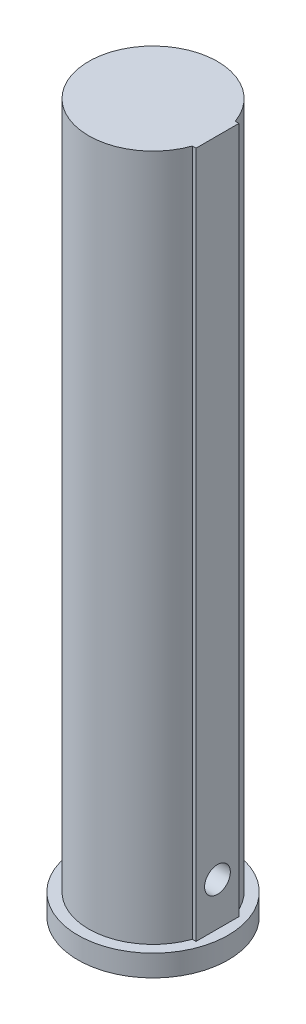
ISO-10303-21;
HEADER;
FILE_DESCRIPTION(('STEP AP214'),'2;1');
FILE_NAME('part.step','',(''),(''),'','','');
FILE_SCHEMA(('AUTOMOTIVE_DESIGN { 1 0 10303 214 1 1 1 1 }'));
ENDSEC;
DATA;
#1=APPLICATION_CONTEXT('core data for automotive mechanical design processes');
#2=APPLICATION_PROTOCOL_DEFINITION('international standard','automotive_design',2000,#1);
#3=PRODUCT_CONTEXT('',#1,'mechanical');
#4=PRODUCT('Part','Part','',(#3));
#5=PRODUCT_RELATED_PRODUCT_CATEGORY('part','',(#4));
#6=PRODUCT_DEFINITION_FORMATION('','',#4);
#7=PRODUCT_DEFINITION_CONTEXT('part definition',#1,'design');
#8=PRODUCT_DEFINITION('design','',#6,#7);
#9=PRODUCT_DEFINITION_SHAPE('','',#8);
#10=(LENGTH_UNIT() NAMED_UNIT(*) SI_UNIT(.MILLI.,.METRE.));
#11=(NAMED_UNIT(*) PLANE_ANGLE_UNIT() SI_UNIT($,.RADIAN.));
#12=(NAMED_UNIT(*) SI_UNIT($,.STERADIAN.) SOLID_ANGLE_UNIT());
#13=UNCERTAINTY_MEASURE_WITH_UNIT(LENGTH_MEASURE(1.E-05),#10,'distance_accuracy_value','');
#14=(GEOMETRIC_REPRESENTATION_CONTEXT(3) GLOBAL_UNCERTAINTY_ASSIGNED_CONTEXT((#13)) GLOBAL_UNIT_ASSIGNED_CONTEXT((#10,
#11,#12)) REPRESENTATION_CONTEXT('',''));
#15=CARTESIAN_POINT('',(0.,0.,0.));
#16=DIRECTION('',(0.,0.,1.));
#17=DIRECTION('',(1.,0.,0.));
#18=AXIS2_PLACEMENT_3D('',#15,#16,#17);
#19=CARTESIAN_POINT('',(15.,-10.0367291130165,-5.));
#20=DIRECTION('',(1.,0.,0.));
#21=DIRECTION('',(0.,0.,-1.));
#22=AXIS2_PLACEMENT_3D('',#19,#20,#21);
#23=PLANE('',#22);
#24=DIRECTION('',(0.,0.,1.));
#25=VECTOR('',#24,1.);
#26=CARTESIAN_POINT('',(15.,0.,-5.));
#27=LINE('',#26,#25);
#28=CARTESIAN_POINT('',(15.,0.,-5.));
#29=VERTEX_POINT('',#28);
#30=CARTESIAN_POINT('',(15.,0.,5.));
#31=VERTEX_POINT('',#30);
#32=EDGE_CURVE('E146',#29,#31,#27,.T.);
#33=ORIENTED_EDGE('',*,*,#32,.F.);
#34=DIRECTION('',(0.,1.,0.));
#35=VECTOR('',#34,1.);
#36=CARTESIAN_POINT('',(15.,-10.0367291130165,-5.));
#37=LINE('',#36,#35);
#38=CARTESIAN_POINT('',(15.,160.,-5.));
#39=VERTEX_POINT('',#38);
#40=EDGE_CURVE('E170',#29,#39,#37,.T.);
#41=ORIENTED_EDGE('',*,*,#40,.T.);
#42=DIRECTION('',(0.,0.,-1.));
#43=VECTOR('',#42,1.);
#44=CARTESIAN_POINT('',(15.,160.,-5.));
#45=LINE('',#44,#43);
#46=CARTESIAN_POINT('',(15.,160.,5.));
#47=VERTEX_POINT('',#46);
#48=EDGE_CURVE('E159',#47,#39,#45,.T.);
#49=ORIENTED_EDGE('',*,*,#48,.F.);
#50=DIRECTION('',(0.,1.,0.));
#51=VECTOR('',#50,1.);
#52=CARTESIAN_POINT('',(15.,-10.0367291130165,5.));
#53=LINE('',#52,#51);
#54=EDGE_CURVE('E174',#31,#47,#53,.T.);
#55=ORIENTED_EDGE('',*,*,#54,.F.);
#56=EDGE_LOOP('',(#33,#41,#49,#55));
#57=FACE_BOUND('',#56,.T.);
#58=CARTESIAN_POINT('',(15.,10.,0.));
#59=DIRECTION('',(1.,0.,0.));
#60=DIRECTION('',(0.,0.,-1.));
#61=AXIS2_PLACEMENT_3D('',#58,#59,#60);
#62=CIRCLE('',#61,3.);
#63=CARTESIAN_POINT('',(15.,10.,-3.));
#64=VERTEX_POINT('',#63);
#65=EDGE_CURVE('E121',#64,#64,#62,.T.);
#66=ORIENTED_EDGE('',*,*,#65,.F.);
#67=EDGE_LOOP('',(#66));
#68=FACE_BOUND('',#67,.T.);
#69=ADVANCED_FACE('F43',(#57,#68),#23,.T.);
#70=CARTESIAN_POINT('',(0.,10.,0.));
#71=DIRECTION('',(1.,0.,0.));
#72=DIRECTION('',(0.,0.,-1.));
#73=AXIS2_PLACEMENT_3D('',#70,#71,#72);
#74=CYLINDRICAL_SURFACE('',#73,1.5);
#75=CARTESIAN_POINT('',(1.5,9.29289321881345,-1.32287565553229));
#76=CARTESIAN_POINT('',(1.4739145337833,9.34832722563109,-1.35249536626977));
#77=CARTESIAN_POINT('',(1.44894131480395,9.40627389915971,-1.37899373581327));
#78=CARTESIAN_POINT('',(1.40359048884177,9.52745260976207,-1.42512143955085));
#79=CARTESIAN_POINT('',(1.38327621847422,9.5907431108936,-1.44465790144486));
#80=CARTESIAN_POINT('',(1.35027299373116,9.72202263899524,-1.47556624435897));
#81=CARTESIAN_POINT('',(1.33765666230707,9.79004986649171,-1.48686055778082));
#82=CARTESIAN_POINT('',(1.32310580286873,9.92771324059383,-1.49983374673648));
#83=CARTESIAN_POINT('',(1.32109194870825,9.9973335132442,-1.50158403278955));
#84=CARTESIAN_POINT('',(1.32746642679957,10.1249794958398,-1.49593899426719));
#85=CARTESIAN_POINT('',(1.33431678238416,10.1831557673976,-1.48989633105986));
#86=CARTESIAN_POINT('',(1.354748711607,10.2975451511324,-1.47134103673938));
#87=CARTESIAN_POINT('',(1.36836832201381,10.3537452260107,-1.45879182762707));
#88=CARTESIAN_POINT('',(1.40015692782228,10.4615662906112,-1.42829470664003));
#89=CARTESIAN_POINT('',(1.4182014397697,10.5132673778039,-1.4104921818831));
#90=CARTESIAN_POINT('',(1.45725096368967,10.6128886126749,-1.37011445537084));
#91=CARTESIAN_POINT('',(1.47822219020455,10.6608433308559,-1.34759242444094));
#92=CARTESIAN_POINT('',(1.5,10.7071067811865,-1.32287565553229));
#93=B_SPLINE_CURVE_WITH_KNOTS('',3,(#75,#76,#77,#78,#79,#80,#81,#82,#83,#84,#85,#86,#87,#88,#89,
#90,#91,#92),.UNSPECIFIED.,.F.,.F.,(4,2,2,2,2,2,2,2,4),(0.,0.204432365123609,0.411497905566482,
0.620487875617342,0.827911968714584,1.00373614181138,1.18055964257078,1.35288702776985,
1.52336833756426),.UNSPECIFIED.);
#94=CARTESIAN_POINT('',(1.5,9.29289321881345,-1.3228756555323));
#95=VERTEX_POINT('',#94);
#96=CARTESIAN_POINT('',(1.5,10.7071067811865,-1.32287565553229));
#97=VERTEX_POINT('',#96);
#98=EDGE_CURVE('E59',#95,#97,#93,.T.);
#99=ORIENTED_EDGE('',*,*,#98,.F.);
#100=CARTESIAN_POINT('',(1.5,10.,0.));
#101=DIRECTION('',(1.,0.,0.));
#102=DIRECTION('',(0.,0.,-1.));
#103=AXIS2_PLACEMENT_3D('',#100,#101,#102);
#104=CIRCLE('',#103,1.5);
#105=CARTESIAN_POINT('',(1.5,9.29289321881345,1.3228756555323));
#106=VERTEX_POINT('',#105);
#107=EDGE_CURVE('E47',#106,#95,#104,.T.);
#108=ORIENTED_EDGE('',*,*,#107,.F.);
#109=CARTESIAN_POINT('',(1.5,10.7071067811865,1.3228756555323));
#110=CARTESIAN_POINT('',(1.4739145337833,10.6516727743689,1.35249536626977));
#111=CARTESIAN_POINT('',(1.44894131480395,10.5937261008403,1.37899373581327));
#112=CARTESIAN_POINT('',(1.40359048884177,10.4725473902379,1.42512143955085));
#113=CARTESIAN_POINT('',(1.38327621847422,10.4092568891064,1.44465790144486));
#114=CARTESIAN_POINT('',(1.35027299373116,10.2779773610048,1.47556624435897));
#115=CARTESIAN_POINT('',(1.33765666230707,10.2099501335083,1.48686055778082));
#116=CARTESIAN_POINT('',(1.32310580286873,10.0722867594062,1.49983374673648));
#117=CARTESIAN_POINT('',(1.32109194870825,10.0026664867558,1.50158403278955));
#118=CARTESIAN_POINT('',(1.32746642679957,9.87502050416024,1.49593899426719));
#119=CARTESIAN_POINT('',(1.33431678238416,9.81684423260236,1.48989633105986));
#120=CARTESIAN_POINT('',(1.354748711607,9.70245484886757,1.47134103673938));
#121=CARTESIAN_POINT('',(1.36836832201381,9.64625477398929,1.45879182762707));
#122=CARTESIAN_POINT('',(1.40015692782228,9.53843370938881,1.42829470664004));
#123=CARTESIAN_POINT('',(1.4182014397697,9.48673262219608,1.4104921818831));
#124=CARTESIAN_POINT('',(1.45725096368967,9.38711138732506,1.37011445537084));
#125=CARTESIAN_POINT('',(1.47822219020455,9.33915666914407,1.34759242444094));
#126=CARTESIAN_POINT('',(1.5,9.29289321881345,1.32287565553229));
#127=B_SPLINE_CURVE_WITH_KNOTS('',3,(#109,#110,#111,#112,#113,#114,#115,#116,#117,#118,#119,
#120,#121,#122,#123,#124,#125,#126),.UNSPECIFIED.,.F.,.F.,(4,2,2,2,2,2,2,2,4),(0.,
0.204432365123608,0.41149790556648,0.620487875617338,0.827911968714583,1.00373614181138,
1.18055964257078,1.35288702776985,1.52336833756426),.UNSPECIFIED.);
#128=CARTESIAN_POINT('',(1.5,10.7071067811865,1.3228756555323));
#129=VERTEX_POINT('',#128);
#130=EDGE_CURVE('E110',#129,#106,#127,.T.);
#131=ORIENTED_EDGE('',*,*,#130,.F.);
#132=EDGE_CURVE('E11',#97,#129,#104,.T.);
#133=ORIENTED_EDGE('',*,*,#132,.F.);
#134=EDGE_LOOP('',(#99,#108,#131,#133));
#135=FACE_BOUND('',#134,.T.);
#136=CARTESIAN_POINT('',(8.,10.,0.));
#137=DIRECTION('',(1.,0.,0.));
#138=DIRECTION('',(0.,0.,-1.));
#139=AXIS2_PLACEMENT_3D('',#136,#137,#138);
#140=CIRCLE('',#139,1.5);
#141=CARTESIAN_POINT('',(8.,10.,-1.5));
#142=VERTEX_POINT('',#141);
#143=EDGE_CURVE('E216',#142,#142,#140,.T.);
#144=ORIENTED_EDGE('',*,*,#143,.T.);
#145=EDGE_LOOP('',(#144));
#146=FACE_BOUND('',#145,.T.);
#147=ADVANCED_FACE('F108',(#135,#146),#74,.F.);
#148=CARTESIAN_POINT('',(1.5,20.,-1.3228756555323));
#149=DIRECTION('',(1.,0.,0.));
#150=DIRECTION('',(0.,0.,-1.));
#151=AXIS2_PLACEMENT_3D('',#148,#149,#150);
#152=PLANE('',#151);
#153=DIRECTION('',(0.,-1.,0.));
#154=VECTOR('',#153,1.);
#155=CARTESIAN_POINT('',(1.5,20.,-1.3228756555323));
#156=LINE('',#155,#154);
#157=CARTESIAN_POINT('',(1.5,20.,-1.3228756555323));
#158=VERTEX_POINT('',#157);
#159=EDGE_CURVE('E128',#158,#97,#156,.T.);
#160=ORIENTED_EDGE('',*,*,#159,.T.);
#161=ORIENTED_EDGE('',*,*,#132,.T.);
#162=DIRECTION('',(0.,-1.,0.));
#163=VECTOR('',#162,1.);
#164=CARTESIAN_POINT('',(1.5,20.,1.3228756555323));
#165=LINE('',#164,#163);
#166=CARTESIAN_POINT('',(1.5,20.,1.3228756555323));
#167=VERTEX_POINT('',#166);
#168=EDGE_CURVE('E119',#167,#129,#165,.T.);
#169=ORIENTED_EDGE('',*,*,#168,.F.);
#170=DIRECTION('',(0.,0.,1.));
#171=VECTOR('',#170,1.);
#172=CARTESIAN_POINT('',(1.5,20.,-1.3228756555323));
#173=LINE('',#172,#171);
#174=EDGE_CURVE('E256',#158,#167,#173,.T.);
#175=ORIENTED_EDGE('',*,*,#174,.F.);
#176=EDGE_LOOP('',(#160,#161,#169,#175));
#177=FACE_BOUND('',#176,.T.);
#178=ADVANCED_FACE('F238',(#177),#152,.F.);
#179=CARTESIAN_POINT('',(0.,160.,0.));
#180=DIRECTION('',(0.,-1.,0.));
#181=DIRECTION('',(0.,0.,-1.));
#182=AXIS2_PLACEMENT_3D('',#179,#180,#181);
#183=CYLINDRICAL_SURFACE('',#182,15.);
#184=CARTESIAN_POINT('',(0.,160.,0.));
#185=DIRECTION('',(0.,1.,0.));
#186=DIRECTION('',(0.,0.,1.));
#187=AXIS2_PLACEMENT_3D('',#184,#185,#186);
#188=CIRCLE('',#187,15.);
#189=CARTESIAN_POINT('',(14.142135623731,160.,-5.));
#190=VERTEX_POINT('',#189);
#191=CARTESIAN_POINT('',(14.142135623731,160.,5.));
#192=VERTEX_POINT('',#191);
#193=EDGE_CURVE('E113',#190,#192,#188,.T.);
#194=ORIENTED_EDGE('',*,*,#193,.F.);
#195=DIRECTION('',(0.,1.,0.));
#196=VECTOR('',#195,1.);
#197=CARTESIAN_POINT('',(14.142135623731,-10.0367291130165,-5.));
#198=LINE('',#197,#196);
#199=CARTESIAN_POINT('',(14.142135623731,0.,-5.));
#200=VERTEX_POINT('',#199);
#201=EDGE_CURVE('E151',#200,#190,#198,.T.);
#202=ORIENTED_EDGE('',*,*,#201,.F.);
#203=CARTESIAN_POINT('',(0.,0.,0.));
#204=DIRECTION('',(0.,1.,0.));
#205=DIRECTION('',(0.,0.,1.));
#206=AXIS2_PLACEMENT_3D('',#203,#204,#205);
#207=CIRCLE('',#206,15.);
#208=CARTESIAN_POINT('',(14.142135623731,0.,5.));
#209=VERTEX_POINT('',#208);
#210=EDGE_CURVE('E182',#200,#209,#207,.T.);
#211=ORIENTED_EDGE('',*,*,#210,.T.);
#212=DIRECTION('',(0.,1.,0.));
#213=VECTOR('',#212,1.);
#214=CARTESIAN_POINT('',(14.142135623731,-10.0367291130165,5.));
#215=LINE('',#214,#213);
#216=EDGE_CURVE('E166',#209,#192,#215,.T.);
#217=ORIENTED_EDGE('',*,*,#216,.T.);
#218=EDGE_LOOP('',(#194,#202,#211,#217));
#219=FACE_BOUND('',#218,.T.);
#220=ADVANCED_FACE('F45',(#219),#183,.T.);
#221=CARTESIAN_POINT('',(0.,160.,0.));
#222=DIRECTION('',(0.,1.,0.));
#223=DIRECTION('',(0.,0.,1.));
#224=AXIS2_PLACEMENT_3D('',#221,#222,#223);
#225=PLANE('',#224);
#226=ORIENTED_EDGE('',*,*,#193,.T.);
#227=DIRECTION('',(1.,0.,0.));
#228=VECTOR('',#227,1.);
#229=CARTESIAN_POINT('',(14.142135623731,160.,5.));
#230=LINE('',#229,#228);
#231=EDGE_CURVE('E142',#192,#47,#230,.T.);
#232=ORIENTED_EDGE('',*,*,#231,.T.);
#233=ORIENTED_EDGE('',*,*,#48,.T.);
#234=DIRECTION('',(-1.,0.,0.));
#235=VECTOR('',#234,1.);
#236=CARTESIAN_POINT('',(14.142135623731,160.,-5.));
#237=LINE('',#236,#235);
#238=EDGE_CURVE('E162',#39,#190,#237,.T.);
#239=ORIENTED_EDGE('',*,*,#238,.T.);
#240=EDGE_LOOP('',(#226,#232,#233,#239));
#241=FACE_BOUND('',#240,.T.);
#242=ADVANCED_FACE('F199',(#241),#225,.T.);
#243=CARTESIAN_POINT('',(14.142135623731,-10.0367291130165,-5.));
#244=DIRECTION('',(0.,0.,-1.));
#245=DIRECTION('',(-1.,0.,0.));
#246=AXIS2_PLACEMENT_3D('',#243,#244,#245);
#247=PLANE('',#246);
#248=DIRECTION('',(1.,0.,0.));
#249=VECTOR('',#248,1.);
#250=CARTESIAN_POINT('',(14.142135623731,0.,-5.));
#251=LINE('',#250,#249);
#252=EDGE_CURVE('E150',#200,#29,#251,.T.);
#253=ORIENTED_EDGE('',*,*,#252,.F.);
#254=ORIENTED_EDGE('',*,*,#201,.T.);
#255=ORIENTED_EDGE('',*,*,#238,.F.);
#256=ORIENTED_EDGE('',*,*,#40,.F.);
#257=EDGE_LOOP('',(#253,#254,#255,#256));
#258=FACE_BOUND('',#257,.T.);
#259=ADVANCED_FACE('F202',(#258),#247,.T.);
#260=CARTESIAN_POINT('',(14.142135623731,-10.0367291130165,5.));
#261=DIRECTION('',(0.,0.,1.));
#262=DIRECTION('',(1.,0.,0.));
#263=AXIS2_PLACEMENT_3D('',#260,#261,#262);
#264=PLANE('',#263);
#265=DIRECTION('',(-1.,0.,0.));
#266=VECTOR('',#265,1.);
#267=CARTESIAN_POINT('',(14.142135623731,0.,5.));
#268=LINE('',#267,#266);
#269=EDGE_CURVE('E155',#31,#209,#268,.T.);
#270=ORIENTED_EDGE('',*,*,#269,.F.);
#271=ORIENTED_EDGE('',*,*,#54,.T.);
#272=ORIENTED_EDGE('',*,*,#231,.F.);
#273=ORIENTED_EDGE('',*,*,#216,.F.);
#274=EDGE_LOOP('',(#270,#271,#272,#273));
#275=FACE_BOUND('',#274,.T.);
#276=ADVANCED_FACE('F195',(#275),#264,.T.);
#277=CARTESIAN_POINT('',(0.,-5.,0.));
#278=DIRECTION('',(0.,1.,0.));
#279=DIRECTION('',(0.,0.,1.));
#280=AXIS2_PLACEMENT_3D('',#277,#278,#279);
#281=CYLINDRICAL_SURFACE('',#280,17.5);
#282=CARTESIAN_POINT('',(0.,-5.,0.));
#283=DIRECTION('',(0.,-1.,0.));
#284=DIRECTION('',(0.,0.,-1.));
#285=AXIS2_PLACEMENT_3D('',#282,#283,#284);
#286=CIRCLE('',#285,17.5);
#287=CARTESIAN_POINT('',(0.,-5.,-17.5));
#288=VERTEX_POINT('',#287);
#289=EDGE_CURVE('E138',#288,#288,#286,.T.);
#290=ORIENTED_EDGE('',*,*,#289,.F.);
#291=EDGE_LOOP('',(#290));
#292=FACE_BOUND('',#291,.T.);
#293=CARTESIAN_POINT('',(0.,0.,0.));
#294=DIRECTION('',(0.,-1.,0.));
#295=DIRECTION('',(0.,0.,-1.));
#296=AXIS2_PLACEMENT_3D('',#293,#294,#295);
#297=CIRCLE('',#296,17.5);
#298=CARTESIAN_POINT('',(0.,0.,-17.5));
#299=VERTEX_POINT('',#298);
#300=EDGE_CURVE('E132',#299,#299,#297,.T.);
#301=ORIENTED_EDGE('',*,*,#300,.T.);
#302=EDGE_LOOP('',(#301));
#303=FACE_BOUND('',#302,.T.);
#304=ADVANCED_FACE('F270',(#292,#303),#281,.T.);
#305=CARTESIAN_POINT('',(0.,-5.,0.));
#306=DIRECTION('',(0.,-1.,0.));
#307=DIRECTION('',(0.,0.,-1.));
#308=AXIS2_PLACEMENT_3D('',#305,#306,#307);
#309=PLANE('',#308);
#310=CARTESIAN_POINT('',(0.,-5.,0.));
#311=DIRECTION('',(0.,-1.,0.));
#312=DIRECTION('',(0.,0.,-1.));
#313=AXIS2_PLACEMENT_3D('',#310,#311,#312);
#314=CIRCLE('',#313,2.);
#315=CARTESIAN_POINT('',(1.5,-5.,1.3228756555323));
#316=VERTEX_POINT('',#315);
#317=CARTESIAN_POINT('',(1.5,-5.,-1.3228756555323));
#318=VERTEX_POINT('',#317);
#319=EDGE_CURVE('E263',#316,#318,#314,.T.);
#320=ORIENTED_EDGE('',*,*,#319,.F.);
#321=DIRECTION('',(0.,0.,1.));
#322=VECTOR('',#321,1.);
#323=CARTESIAN_POINT('',(1.5,-5.,-1.3228756555323));
#324=LINE('',#323,#322);
#325=EDGE_CURVE('E125',#318,#316,#324,.T.);
#326=ORIENTED_EDGE('',*,*,#325,.F.);
#327=EDGE_LOOP('',(#320,#326));
#328=FACE_BOUND('',#327,.T.);
#329=ORIENTED_EDGE('',*,*,#289,.T.);
#330=EDGE_LOOP('',(#329));
#331=FACE_BOUND('',#330,.T.);
#332=ADVANCED_FACE('F267',(#328,#331),#309,.T.);
#333=CARTESIAN_POINT('',(0.,0.,0.));
#334=DIRECTION('',(0.,-1.,0.));
#335=DIRECTION('',(0.,0.,-1.));
#336=AXIS2_PLACEMENT_3D('',#333,#334,#335);
#337=PLANE('',#336);
#338=ORIENTED_EDGE('',*,*,#210,.F.);
#339=ORIENTED_EDGE('',*,*,#252,.T.);
#340=ORIENTED_EDGE('',*,*,#32,.T.);
#341=ORIENTED_EDGE('',*,*,#269,.T.);
#342=EDGE_LOOP('',(#338,#339,#340,#341));
#343=FACE_BOUND('',#342,.T.);
#344=ORIENTED_EDGE('',*,*,#300,.F.);
#345=EDGE_LOOP('',(#344));
#346=FACE_BOUND('',#345,.T.);
#347=ADVANCED_FACE('F192',(#343,#346),#337,.F.);
#348=CARTESIAN_POINT('',(0.,20.,0.));
#349=DIRECTION('',(0.,-1.,0.));
#350=DIRECTION('',(0.,0.,-1.));
#351=AXIS2_PLACEMENT_3D('',#348,#349,#350);
#352=CYLINDRICAL_SURFACE('',#351,2.);
#353=EDGE_CURVE('E66',#95,#318,#156,.T.);
#354=ORIENTED_EDGE('',*,*,#353,.F.);
#355=ORIENTED_EDGE('',*,*,#98,.T.);
#356=ORIENTED_EDGE('',*,*,#159,.F.);
#357=CARTESIAN_POINT('',(0.,20.,0.));
#358=DIRECTION('',(0.,-1.,0.));
#359=DIRECTION('',(0.,0.,-1.));
#360=AXIS2_PLACEMENT_3D('',#357,#358,#359);
#361=CIRCLE('',#360,2.);
#362=EDGE_CURVE('E258',#167,#158,#361,.T.);
#363=ORIENTED_EDGE('',*,*,#362,.F.);
#364=ORIENTED_EDGE('',*,*,#168,.T.);
#365=ORIENTED_EDGE('',*,*,#130,.T.);
#366=EDGE_CURVE('E117',#106,#316,#165,.T.);
#367=ORIENTED_EDGE('',*,*,#366,.T.);
#368=ORIENTED_EDGE('',*,*,#319,.T.);
#369=EDGE_LOOP('',(#354,#355,#356,#363,#364,#365,#367,#368));
#370=FACE_BOUND('',#369,.T.);
#371=ADVANCED_FACE('F116',(#370),#352,.F.);
#372=ORIENTED_EDGE('',*,*,#366,.F.);
#373=ORIENTED_EDGE('',*,*,#107,.T.);
#374=ORIENTED_EDGE('',*,*,#353,.T.);
#375=ORIENTED_EDGE('',*,*,#325,.T.);
#376=EDGE_LOOP('',(#372,#373,#374,#375));
#377=FACE_BOUND('',#376,.T.);
#378=ADVANCED_FACE('F123',(#377),#152,.F.);
#379=CARTESIAN_POINT('',(0.,20.,0.));
#380=DIRECTION('',(0.,-1.,0.));
#381=DIRECTION('',(0.,0.,-1.));
#382=AXIS2_PLACEMENT_3D('',#379,#380,#381);
#383=PLANE('',#382);
#384=ORIENTED_EDGE('',*,*,#362,.T.);
#385=ORIENTED_EDGE('',*,*,#174,.T.);
#386=EDGE_LOOP('',(#384,#385));
#387=FACE_BOUND('',#386,.T.);
#388=ADVANCED_FACE('F241',(#387),#383,.T.);
#389=CARTESIAN_POINT('',(17.501,10.,0.));
#390=DIRECTION('',(-1.,0.,0.));
#391=DIRECTION('',(0.,0.,1.));
#392=AXIS2_PLACEMENT_3D('',#389,#390,#391);
#393=CYLINDRICAL_SURFACE('',#392,3.);
#394=ORIENTED_EDGE('',*,*,#65,.T.);
#395=EDGE_LOOP('',(#394));
#396=FACE_BOUND('',#395,.T.);
#397=CARTESIAN_POINT('',(8.,10.,0.));
#398=DIRECTION('',(1.,0.,0.));
#399=DIRECTION('',(0.,0.,-1.));
#400=AXIS2_PLACEMENT_3D('',#397,#398,#399);
#401=CIRCLE('',#400,3.);
#402=CARTESIAN_POINT('',(8.,10.,-3.));
#403=VERTEX_POINT('',#402);
#404=EDGE_CURVE('E212',#403,#403,#401,.T.);
#405=ORIENTED_EDGE('',*,*,#404,.F.);
#406=EDGE_LOOP('',(#405));
#407=FACE_BOUND('',#406,.T.);
#408=ADVANCED_FACE('F239',(#396,#407),#393,.F.);
#409=CARTESIAN_POINT('',(8.,10.,0.));
#410=DIRECTION('',(1.,0.,0.));
#411=DIRECTION('',(0.,0.,-1.));
#412=AXIS2_PLACEMENT_3D('',#409,#410,#411);
#413=PLANE('',#412);
#414=ORIENTED_EDGE('',*,*,#143,.F.);
#415=EDGE_LOOP('',(#414));
#416=FACE_BOUND('',#415,.T.);
#417=ORIENTED_EDGE('',*,*,#404,.T.);
#418=EDGE_LOOP('',(#417));
#419=FACE_BOUND('',#418,.T.);
#420=ADVANCED_FACE('F354',(#416,#419),#413,.T.);
#421=CLOSED_SHELL('',(#69,#147,#178,#220,#242,#259,#276,#304,#332,#347,#371,#378,#388,#408,#420));
#422=MANIFOLD_SOLID_BREP('B2',#421);
#423=ADVANCED_BREP_SHAPE_REPRESENTATION('',(#18,#422),#14);
#424=SHAPE_DEFINITION_REPRESENTATION(#9,#423);
ENDSEC;
END-ISO-10303-21;
